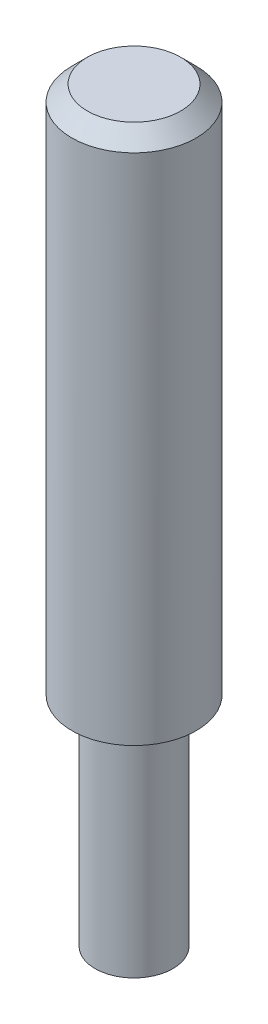
ISO-10303-21;
HEADER;
FILE_DESCRIPTION(('STEP AP214'),'2;1');
FILE_NAME('part.step','',(''),(''),'','','');
FILE_SCHEMA(('AUTOMOTIVE_DESIGN { 1 0 10303 214 1 1 1 1 }'));
ENDSEC;
DATA;
#1=APPLICATION_CONTEXT('core data for automotive mechanical design processes');
#2=APPLICATION_PROTOCOL_DEFINITION('international standard','automotive_design',2000,#1);
#3=PRODUCT_CONTEXT('',#1,'mechanical');
#4=PRODUCT('Part','Part','',(#3));
#5=PRODUCT_RELATED_PRODUCT_CATEGORY('part','',(#4));
#6=PRODUCT_DEFINITION_FORMATION('','',#4);
#7=PRODUCT_DEFINITION_CONTEXT('part definition',#1,'design');
#8=PRODUCT_DEFINITION('design','',#6,#7);
#9=PRODUCT_DEFINITION_SHAPE('','',#8);
#10=(LENGTH_UNIT() NAMED_UNIT(*) SI_UNIT(.MILLI.,.METRE.));
#11=(NAMED_UNIT(*) PLANE_ANGLE_UNIT() SI_UNIT($,.RADIAN.));
#12=(NAMED_UNIT(*) SI_UNIT($,.STERADIAN.) SOLID_ANGLE_UNIT());
#13=UNCERTAINTY_MEASURE_WITH_UNIT(LENGTH_MEASURE(1.E-05),#10,'distance_accuracy_value','');
#14=(GEOMETRIC_REPRESENTATION_CONTEXT(3) GLOBAL_UNCERTAINTY_ASSIGNED_CONTEXT((#13)) GLOBAL_UNIT_ASSIGNED_CONTEXT((#10,
#11,#12)) REPRESENTATION_CONTEXT('',''));
#15=CARTESIAN_POINT('',(0.,0.,0.));
#16=DIRECTION('',(0.,0.,1.));
#17=DIRECTION('',(1.,0.,0.));
#18=AXIS2_PLACEMENT_3D('',#15,#16,#17);
#19=CARTESIAN_POINT('',(0.,48.,0.));
#20=DIRECTION('',(0.,-1.,0.));
#21=DIRECTION('',(0.,0.,-1.));
#22=AXIS2_PLACEMENT_3D('',#19,#20,#21);
#23=CYLINDRICAL_SURFACE('',#22,4.);
#24=CARTESIAN_POINT('',(0.,47.,0.));
#25=DIRECTION('',(0.,1.,0.));
#26=DIRECTION('',(0.,0.,1.));
#27=AXIS2_PLACEMENT_3D('',#24,#25,#26);
#28=CIRCLE('',#27,4.);
#29=CARTESIAN_POINT('',(0.,47.,4.));
#30=VERTEX_POINT('',#29);
#31=EDGE_CURVE('E10',#30,#30,#28,.F.);
#32=ORIENTED_EDGE('',*,*,#31,.T.);
#33=EDGE_LOOP('',(#32));
#34=FACE_BOUND('',#33,.T.);
#35=CARTESIAN_POINT('',(0.,14.,0.));
#36=DIRECTION('',(0.,-1.,0.));
#37=DIRECTION('',(0.,0.,-1.));
#38=AXIS2_PLACEMENT_3D('',#35,#36,#37);
#39=CIRCLE('',#38,4.);
#40=CARTESIAN_POINT('',(0.,14.,-4.));
#41=VERTEX_POINT('',#40);
#42=EDGE_CURVE('E50',#41,#41,#39,.T.);
#43=ORIENTED_EDGE('',*,*,#42,.F.);
#44=EDGE_LOOP('',(#43));
#45=FACE_BOUND('',#44,.T.);
#46=ADVANCED_FACE('F37',(#34,#45),#23,.T.);
#47=CARTESIAN_POINT('',(0.,48.,0.));
#48=DIRECTION('',(0.,1.,0.));
#49=DIRECTION('',(0.,0.,1.));
#50=AXIS2_PLACEMENT_3D('',#47,#48,#49);
#51=PLANE('',#50);
#52=CARTESIAN_POINT('',(0.,48.,0.));
#53=DIRECTION('',(0.,1.,0.));
#54=DIRECTION('',(0.,0.,1.));
#55=AXIS2_PLACEMENT_3D('',#52,#53,#54);
#56=CIRCLE('',#55,3.);
#57=CARTESIAN_POINT('',(0.,48.,3.));
#58=VERTEX_POINT('',#57);
#59=EDGE_CURVE('E45',#58,#58,#56,.T.);
#60=ORIENTED_EDGE('',*,*,#59,.T.);
#61=EDGE_LOOP('',(#60));
#62=FACE_BOUND('',#61,.T.);
#63=ADVANCED_FACE('F72',(#62),#51,.T.);
#64=CARTESIAN_POINT('',(0.,14.,0.));
#65=DIRECTION('',(0.,-1.,0.));
#66=DIRECTION('',(0.,0.,-1.));
#67=AXIS2_PLACEMENT_3D('',#64,#65,#66);
#68=PLANE('',#67);
#69=CARTESIAN_POINT('',(0.,14.,0.));
#70=DIRECTION('',(0.,-1.,0.));
#71=DIRECTION('',(0.,0.,-1.));
#72=AXIS2_PLACEMENT_3D('',#69,#70,#71);
#73=CIRCLE('',#72,2.5);
#74=CARTESIAN_POINT('',(0.,14.,-2.5));
#75=VERTEX_POINT('',#74);
#76=EDGE_CURVE('E55',#75,#75,#73,.T.);
#77=ORIENTED_EDGE('',*,*,#76,.F.);
#78=EDGE_LOOP('',(#77));
#79=FACE_BOUND('',#78,.T.);
#80=ORIENTED_EDGE('',*,*,#42,.T.);
#81=EDGE_LOOP('',(#80));
#82=FACE_BOUND('',#81,.T.);
#83=ADVANCED_FACE('F69',(#79,#82),#68,.T.);
#84=CARTESIAN_POINT('',(0.,14.,0.));
#85=DIRECTION('',(0.,-1.,0.));
#86=DIRECTION('',(0.,0.,-1.));
#87=AXIS2_PLACEMENT_3D('',#84,#85,#86);
#88=CYLINDRICAL_SURFACE('',#87,2.5);
#89=ORIENTED_EDGE('',*,*,#76,.T.);
#90=EDGE_LOOP('',(#89));
#91=FACE_BOUND('',#90,.T.);
#92=CARTESIAN_POINT('',(0.,0.,0.));
#93=DIRECTION('',(0.,-1.,0.));
#94=DIRECTION('',(0.,0.,-1.));
#95=AXIS2_PLACEMENT_3D('',#92,#93,#94);
#96=CIRCLE('',#95,2.5);
#97=CARTESIAN_POINT('',(0.,0.,-2.5));
#98=VERTEX_POINT('',#97);
#99=EDGE_CURVE('E58',#98,#98,#96,.T.);
#100=ORIENTED_EDGE('',*,*,#99,.F.);
#101=EDGE_LOOP('',(#100));
#102=FACE_BOUND('',#101,.T.);
#103=ADVANCED_FACE('F66',(#91,#102),#88,.T.);
#104=CARTESIAN_POINT('',(0.,0.,0.));
#105=DIRECTION('',(0.,1.,0.));
#106=DIRECTION('',(0.,0.,1.));
#107=AXIS2_PLACEMENT_3D('',#104,#105,#106);
#108=PLANE('',#107);
#109=ORIENTED_EDGE('',*,*,#99,.T.);
#110=EDGE_LOOP('',(#109));
#111=FACE_BOUND('',#110,.T.);
#112=ADVANCED_FACE('F82',(#111),#108,.F.);
#113=CARTESIAN_POINT('',(0.,48.,0.));
#114=DIRECTION('',(0.,-1.,0.));
#115=DIRECTION('',(0.,0.,-1.));
#116=AXIS2_PLACEMENT_3D('',#113,#114,#115);
#117=CONICAL_SURFACE('',#116,3.,0.785398163397443);
#118=ORIENTED_EDGE('',*,*,#31,.F.);
#119=EDGE_LOOP('',(#118));
#120=FACE_BOUND('',#119,.T.);
#121=ORIENTED_EDGE('',*,*,#59,.F.);
#122=EDGE_LOOP('',(#121));
#123=FACE_BOUND('',#122,.T.);
#124=ADVANCED_FACE('F39',(#120,#123),#117,.T.);
#125=CLOSED_SHELL('',(#46,#63,#83,#103,#112,#124));
#126=MANIFOLD_SOLID_BREP('B2',#125);
#127=ADVANCED_BREP_SHAPE_REPRESENTATION('',(#18,#126),#14);
#128=SHAPE_DEFINITION_REPRESENTATION(#9,#127);
ENDSEC;
END-ISO-10303-21;
